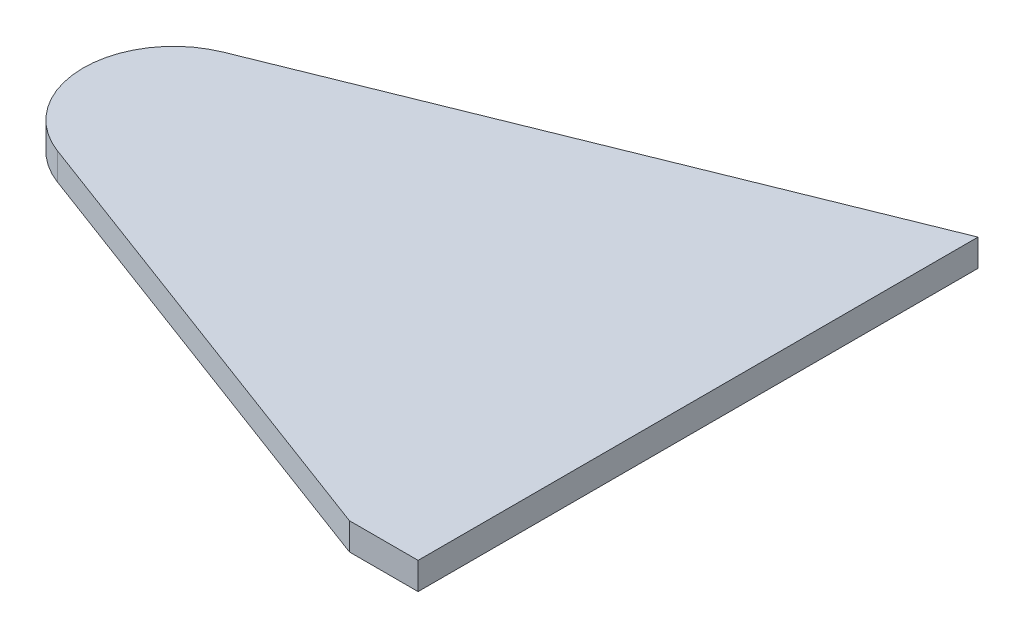
ISO-10303-21;
HEADER;
FILE_DESCRIPTION(('STEP AP214'),'2;1');
FILE_NAME('part.step','',(''),(''),'','','');
FILE_SCHEMA(('AUTOMOTIVE_DESIGN { 1 0 10303 214 1 1 1 1 }'));
ENDSEC;
DATA;
#1=APPLICATION_CONTEXT('core data for automotive mechanical design processes');
#2=APPLICATION_PROTOCOL_DEFINITION('international standard','automotive_design',2000,#1);
#3=PRODUCT_CONTEXT('',#1,'mechanical');
#4=PRODUCT('Part','Part','',(#3));
#5=PRODUCT_RELATED_PRODUCT_CATEGORY('part','',(#4));
#6=PRODUCT_DEFINITION_FORMATION('','',#4);
#7=PRODUCT_DEFINITION_CONTEXT('part definition',#1,'design');
#8=PRODUCT_DEFINITION('design','',#6,#7);
#9=PRODUCT_DEFINITION_SHAPE('','',#8);
#10=(LENGTH_UNIT() NAMED_UNIT(*) SI_UNIT(.MILLI.,.METRE.));
#11=(NAMED_UNIT(*) PLANE_ANGLE_UNIT() SI_UNIT($,.RADIAN.));
#12=(NAMED_UNIT(*) SI_UNIT($,.STERADIAN.) SOLID_ANGLE_UNIT());
#13=UNCERTAINTY_MEASURE_WITH_UNIT(LENGTH_MEASURE(1.E-05),#10,'distance_accuracy_value','');
#14=(GEOMETRIC_REPRESENTATION_CONTEXT(3) GLOBAL_UNCERTAINTY_ASSIGNED_CONTEXT((#13)) GLOBAL_UNIT_ASSIGNED_CONTEXT((#10,
#11,#12)) REPRESENTATION_CONTEXT('',''));
#15=CARTESIAN_POINT('',(0.,0.,0.));
#16=DIRECTION('',(0.,0.,1.));
#17=DIRECTION('',(1.,0.,0.));
#18=AXIS2_PLACEMENT_3D('',#15,#16,#17);
#19=CARTESIAN_POINT('',(0.,15.,0.));
#20=DIRECTION('',(0.,0.,-1.));
#21=DIRECTION('',(-1.,0.,0.));
#22=AXIS2_PLACEMENT_3D('',#19,#20,#21);
#23=PLANE('',#22);
#24=DIRECTION('',(1.,0.,0.));
#25=VECTOR('',#24,1.);
#26=CARTESIAN_POINT('',(0.,0.,0.));
#27=LINE('',#26,#25);
#28=CARTESIAN_POINT('',(0.,0.,0.));
#29=VERTEX_POINT('',#28);
#30=CARTESIAN_POINT('',(38.,0.,0.));
#31=VERTEX_POINT('',#30);
#32=EDGE_CURVE('E118',#29,#31,#27,.T.);
#33=ORIENTED_EDGE('',*,*,#32,.T.);
#34=DIRECTION('',(0.,-1.,0.));
#35=VECTOR('',#34,1.);
#36=CARTESIAN_POINT('',(38.,15.,0.));
#37=LINE('',#36,#35);
#38=CARTESIAN_POINT('',(38.,15.,0.));
#39=VERTEX_POINT('',#38);
#40=EDGE_CURVE('E96',#39,#31,#37,.T.);
#41=ORIENTED_EDGE('',*,*,#40,.F.);
#42=DIRECTION('',(1.,0.,0.));
#43=VECTOR('',#42,1.);
#44=CARTESIAN_POINT('',(0.,15.,0.));
#45=LINE('',#44,#43);
#46=CARTESIAN_POINT('',(0.,15.,0.));
#47=VERTEX_POINT('',#46);
#48=EDGE_CURVE('E83',#47,#39,#45,.T.);
#49=ORIENTED_EDGE('',*,*,#48,.F.);
#50=DIRECTION('',(0.,-1.,0.));
#51=VECTOR('',#50,1.);
#52=CARTESIAN_POINT('',(0.,15.,0.));
#53=LINE('',#52,#51);
#54=EDGE_CURVE('E94',#47,#29,#53,.T.);
#55=ORIENTED_EDGE('',*,*,#54,.T.);
#56=EDGE_LOOP('',(#33,#41,#49,#55));
#57=FACE_BOUND('',#56,.T.);
#58=ADVANCED_FACE('F35',(#57),#23,.F.);
#59=CARTESIAN_POINT('',(38.,15.,0.));
#60=DIRECTION('',(-1.,0.,0.));
#61=DIRECTION('',(0.,0.,1.));
#62=AXIS2_PLACEMENT_3D('',#59,#60,#61);
#63=PLANE('',#62);
#64=DIRECTION('',(0.,0.,-1.));
#65=VECTOR('',#64,1.);
#66=CARTESIAN_POINT('',(38.,0.,0.));
#67=LINE('',#66,#65);
#68=CARTESIAN_POINT('',(38.,0.,-310.));
#69=VERTEX_POINT('',#68);
#70=EDGE_CURVE('E115',#31,#69,#67,.T.);
#71=ORIENTED_EDGE('',*,*,#70,.T.);
#72=DIRECTION('',(0.,-1.,0.));
#73=VECTOR('',#72,1.);
#74=CARTESIAN_POINT('',(38.,15.,-310.));
#75=LINE('',#74,#73);
#76=CARTESIAN_POINT('',(38.,15.,-310.));
#77=VERTEX_POINT('',#76);
#78=EDGE_CURVE('E105',#77,#69,#75,.T.);
#79=ORIENTED_EDGE('',*,*,#78,.F.);
#80=DIRECTION('',(0.,0.,-1.));
#81=VECTOR('',#80,1.);
#82=CARTESIAN_POINT('',(38.,15.,0.));
#83=LINE('',#82,#81);
#84=EDGE_CURVE('E98',#39,#77,#83,.T.);
#85=ORIENTED_EDGE('',*,*,#84,.F.);
#86=ORIENTED_EDGE('',*,*,#40,.T.);
#87=EDGE_LOOP('',(#71,#79,#85,#86));
#88=FACE_BOUND('',#87,.T.);
#89=ADVANCED_FACE('F123',(#88),#63,.F.);
#90=CARTESIAN_POINT('',(-258.698833461373,15.,-190.12589010691));
#91=DIRECTION('',(0.374606593415907,0.,0.92718385456679));
#92=DIRECTION('',(0.92718385456679,0.,-0.374606593415907));
#93=AXIS2_PLACEMENT_3D('',#90,#91,#92);
#94=PLANE('',#93);
#95=DIRECTION('',(-0.92718385456679,0.,0.374606593415907));
#96=VECTOR('',#95,1.);
#97=CARTESIAN_POINT('',(-258.698833461373,0.,-190.12589010691));
#98=LINE('',#97,#96);
#99=CARTESIAN_POINT('',(-259.554563932101,0.,-189.78015255449));
#100=VERTEX_POINT('',#99);
#101=EDGE_CURVE('E113',#69,#100,#98,.T.);
#102=ORIENTED_EDGE('',*,*,#101,.T.);
#103=DIRECTION('',(0.,-1.,0.));
#104=VECTOR('',#103,1.);
#105=CARTESIAN_POINT('',(-259.554563932101,15.,-189.78015255449));
#106=LINE('',#105,#104);
#107=CARTESIAN_POINT('',(-259.554563932101,15.,-189.78015255449));
#108=VERTEX_POINT('',#107);
#109=EDGE_CURVE('E43',#100,#108,#106,.F.);
#110=ORIENTED_EDGE('',*,*,#109,.T.);
#111=DIRECTION('',(-0.92718385456679,0.,0.374606593415907));
#112=VECTOR('',#111,1.);
#113=CARTESIAN_POINT('',(-258.698833461373,15.,-190.12589010691));
#114=LINE('',#113,#112);
#115=EDGE_CURVE('E111',#77,#108,#114,.T.);
#116=ORIENTED_EDGE('',*,*,#115,.F.);
#117=ORIENTED_EDGE('',*,*,#78,.T.);
#118=EDGE_LOOP('',(#102,#110,#116,#117));
#119=FACE_BOUND('',#118,.T.);
#120=ADVANCED_FACE('F125',(#119),#94,.F.);
#121=CARTESIAN_POINT('',(-262.268212989552,15.,-98.0580667526492));
#122=DIRECTION('',(0.350207381259462,0.,-0.9366721892484));
#123=DIRECTION('',(-0.9366721892484,0.,-0.350207381259462));
#124=AXIS2_PLACEMENT_3D('',#121,#122,#123);
#125=PLANE('',#124);
#126=DIRECTION('',(0.9366721892484,0.,0.350207381259461));
#127=VECTOR('',#126,1.);
#128=CARTESIAN_POINT('',(0.,15.,0.));
#129=LINE('',#128,#127);
#130=CARTESIAN_POINT('',(-258.334603324278,15.,-96.5873503637301));
#131=VERTEX_POINT('',#130);
#132=EDGE_CURVE('E80',#131,#47,#129,.T.);
#133=ORIENTED_EDGE('',*,*,#132,.F.);
#134=DIRECTION('',(0.,-1.,0.));
#135=VECTOR('',#134,1.);
#136=CARTESIAN_POINT('',(-258.334603324278,15.,-96.58735036373));
#137=LINE('',#136,#135);
#138=CARTESIAN_POINT('',(-258.334603324278,0.,-96.58735036373));
#139=VERTEX_POINT('',#138);
#140=EDGE_CURVE('E102',#131,#139,#137,.T.);
#141=ORIENTED_EDGE('',*,*,#140,.T.);
#142=DIRECTION('',(0.9366721892484,0.,0.350207381259462));
#143=VECTOR('',#142,1.);
#144=CARTESIAN_POINT('',(-262.268212989552,0.,-98.0580667526492));
#145=LINE('',#144,#143);
#146=EDGE_CURVE('E90',#139,#29,#145,.T.);
#147=ORIENTED_EDGE('',*,*,#146,.T.);
#148=ORIENTED_EDGE('',*,*,#54,.F.);
#149=EDGE_LOOP('',(#133,#141,#147,#148));
#150=FACE_BOUND('',#149,.T.);
#151=ADVANCED_FACE('F100',(#150),#125,.F.);
#152=CARTESIAN_POINT('',(0.,15.,0.));
#153=DIRECTION('',(0.,-1.,0.));
#154=DIRECTION('',(0.,0.,-1.));
#155=AXIS2_PLACEMENT_3D('',#152,#153,#154);
#156=PLANE('',#155);
#157=ORIENTED_EDGE('',*,*,#115,.T.);
#158=CARTESIAN_POINT('',(-240.824234261305,15.,-143.42095982615));
#159=DIRECTION('',(0.,-1.,0.));
#160=DIRECTION('',(0.,0.,-1.));
#161=AXIS2_PLACEMENT_3D('',#158,#159,#160);
#162=CIRCLE('',#161,50.);
#163=EDGE_CURVE('E11',#108,#131,#162,.F.);
#164=ORIENTED_EDGE('',*,*,#163,.T.);
#165=ORIENTED_EDGE('',*,*,#132,.T.);
#166=ORIENTED_EDGE('',*,*,#48,.T.);
#167=ORIENTED_EDGE('',*,*,#84,.T.);
#168=EDGE_LOOP('',(#157,#164,#165,#166,#167));
#169=FACE_BOUND('',#168,.T.);
#170=ADVANCED_FACE('F82',(#169),#156,.F.);
#171=CARTESIAN_POINT('',(0.,0.,0.));
#172=DIRECTION('',(0.,-1.,0.));
#173=DIRECTION('',(0.,0.,-1.));
#174=AXIS2_PLACEMENT_3D('',#171,#172,#173);
#175=PLANE('',#174);
#176=ORIENTED_EDGE('',*,*,#146,.F.);
#177=CARTESIAN_POINT('',(-240.824234261305,0.,-143.42095982615));
#178=DIRECTION('',(0.,-1.,0.));
#179=DIRECTION('',(0.,0.,-1.));
#180=AXIS2_PLACEMENT_3D('',#177,#178,#179);
#181=CIRCLE('',#180,50.);
#182=EDGE_CURVE('E57',#139,#100,#181,.T.);
#183=ORIENTED_EDGE('',*,*,#182,.T.);
#184=ORIENTED_EDGE('',*,*,#101,.F.);
#185=ORIENTED_EDGE('',*,*,#70,.F.);
#186=ORIENTED_EDGE('',*,*,#32,.F.);
#187=EDGE_LOOP('',(#176,#183,#184,#185,#186));
#188=FACE_BOUND('',#187,.T.);
#189=ADVANCED_FACE('F162',(#188),#175,.T.);
#190=CARTESIAN_POINT('',(-240.824234261305,15.,-143.42095982615));
#191=DIRECTION('',(0.,-1.,0.));
#192=DIRECTION('',(0.,0.,-1.));
#193=AXIS2_PLACEMENT_3D('',#190,#191,#192);
#194=CYLINDRICAL_SURFACE('',#193,50.);
#195=ORIENTED_EDGE('',*,*,#163,.F.);
#196=ORIENTED_EDGE('',*,*,#109,.F.);
#197=ORIENTED_EDGE('',*,*,#182,.F.);
#198=ORIENTED_EDGE('',*,*,#140,.F.);
#199=EDGE_LOOP('',(#195,#196,#197,#198));
#200=FACE_BOUND('',#199,.T.);
#201=ADVANCED_FACE('F37',(#200),#194,.T.);
#202=CLOSED_SHELL('',(#58,#89,#120,#151,#170,#189,#201));
#203=MANIFOLD_SOLID_BREP('B2',#202);
#204=ADVANCED_BREP_SHAPE_REPRESENTATION('',(#18,#203),#14);
#205=SHAPE_DEFINITION_REPRESENTATION(#9,#204);
ENDSEC;
END-ISO-10303-21;
